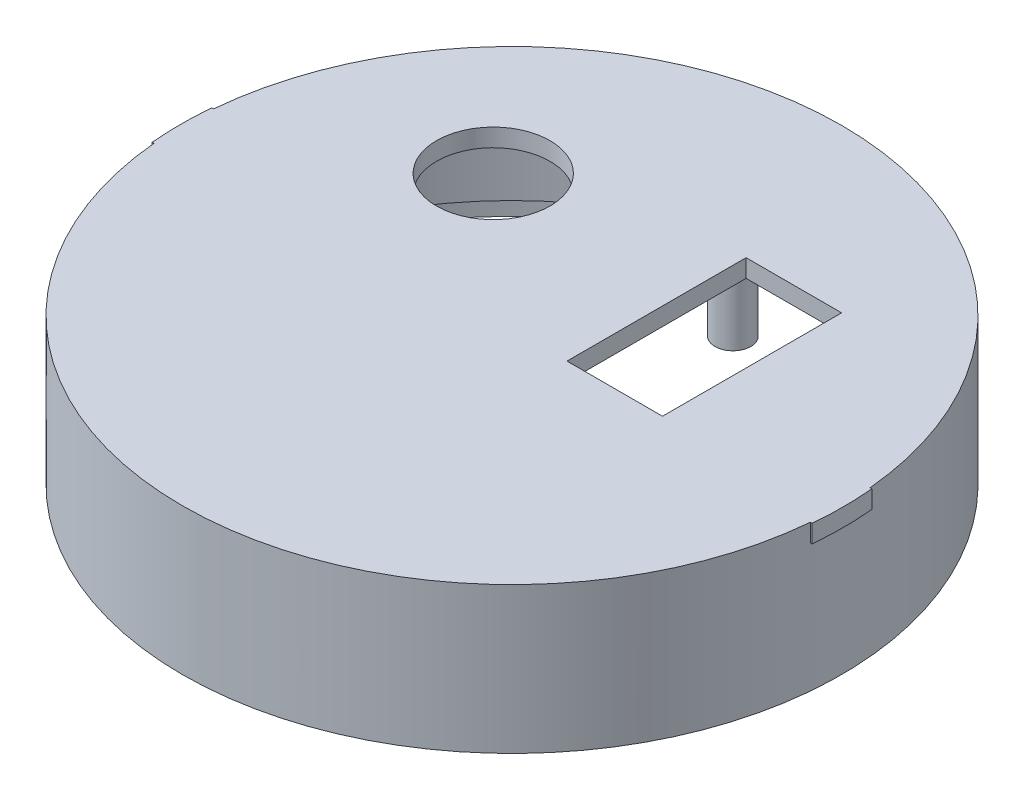
ISO-10303-21;
HEADER;
FILE_DESCRIPTION(('STEP AP214'),'2;1');
FILE_NAME('part.step','',(''),(''),'','','');
FILE_SCHEMA(('AUTOMOTIVE_DESIGN { 1 0 10303 214 1 1 1 1 }'));
ENDSEC;
DATA;
#1=APPLICATION_CONTEXT('core data for automotive mechanical design processes');
#2=APPLICATION_PROTOCOL_DEFINITION('international standard','automotive_design',2000,#1);
#3=PRODUCT_CONTEXT('',#1,'mechanical');
#4=PRODUCT('Part','Part','',(#3));
#5=PRODUCT_RELATED_PRODUCT_CATEGORY('part','',(#4));
#6=PRODUCT_DEFINITION_FORMATION('','',#4);
#7=PRODUCT_DEFINITION_CONTEXT('part definition',#1,'design');
#8=PRODUCT_DEFINITION('design','',#6,#7);
#9=PRODUCT_DEFINITION_SHAPE('','',#8);
#10=(LENGTH_UNIT() NAMED_UNIT(*) SI_UNIT(.MILLI.,.METRE.));
#11=(NAMED_UNIT(*) PLANE_ANGLE_UNIT() SI_UNIT($,.RADIAN.));
#12=(NAMED_UNIT(*) SI_UNIT($,.STERADIAN.) SOLID_ANGLE_UNIT());
#13=UNCERTAINTY_MEASURE_WITH_UNIT(LENGTH_MEASURE(1.E-05),#10,'distance_accuracy_value','');
#14=(GEOMETRIC_REPRESENTATION_CONTEXT(3) GLOBAL_UNCERTAINTY_ASSIGNED_CONTEXT((#13)) GLOBAL_UNIT_ASSIGNED_CONTEXT((#10,
#11,#12)) REPRESENTATION_CONTEXT('',''));
#15=CARTESIAN_POINT('',(0.,0.,0.));
#16=DIRECTION('',(0.,0.,1.));
#17=DIRECTION('',(1.,0.,0.));
#18=AXIS2_PLACEMENT_3D('',#15,#16,#17);
#19=CARTESIAN_POINT('',(0.,0.,0.));
#20=DIRECTION('',(0.,1.,0.));
#21=DIRECTION('',(0.,0.,1.));
#22=AXIS2_PLACEMENT_3D('',#19,#20,#21);
#23=CYLINDRICAL_SURFACE('',#22,55.);
#24=DIRECTION('',(0.,1.,0.));
#25=VECTOR('',#24,1.);
#26=CARTESIAN_POINT('',(-54.7722557505166,0.,5.));
#27=LINE('',#26,#25);
#28=CARTESIAN_POINT('',(-54.7722557505166,0.,5.));
#29=VERTEX_POINT('',#28);
#30=CARTESIAN_POINT('',(-54.7722557505166,3.,5.));
#31=VERTEX_POINT('',#30);
#32=EDGE_CURVE('E315',#29,#31,#27,.T.);
#33=ORIENTED_EDGE('',*,*,#32,.T.);
#34=CARTESIAN_POINT('',(0.,3.,0.));
#35=DIRECTION('',(0.,1.,0.));
#36=DIRECTION('',(0.,0.,1.));
#37=AXIS2_PLACEMENT_3D('',#34,#35,#36);
#38=CIRCLE('',#37,55.);
#39=CARTESIAN_POINT('',(-54.7722557505166,3.,-4.99999999999996));
#40=VERTEX_POINT('',#39);
#41=EDGE_CURVE('E343',#31,#40,#38,.T.);
#42=ORIENTED_EDGE('',*,*,#41,.T.);
#43=DIRECTION('',(0.,1.,0.));
#44=VECTOR('',#43,1.);
#45=CARTESIAN_POINT('',(-54.7722557505166,0.,-4.99999999999996));
#46=LINE('',#45,#44);
#47=CARTESIAN_POINT('',(-54.7722557505166,0.,-4.99999999999996));
#48=VERTEX_POINT('',#47);
#49=EDGE_CURVE('E308',#48,#40,#46,.T.);
#50=ORIENTED_EDGE('',*,*,#49,.F.);
#51=CARTESIAN_POINT('',(0.,0.,0.));
#52=DIRECTION('',(0.,1.,0.));
#53=DIRECTION('',(0.,0.,1.));
#54=AXIS2_PLACEMENT_3D('',#51,#52,#53);
#55=CIRCLE('',#54,55.);
#56=EDGE_CURVE('E53',#29,#48,#55,.T.);
#57=ORIENTED_EDGE('',*,*,#56,.F.);
#58=EDGE_LOOP('',(#33,#42,#50,#57));
#59=FACE_BOUND('',#58,.T.);
#60=ADVANCED_FACE('F45',(#59),#23,.F.);
#61=CARTESIAN_POINT('',(0.,3.,0.));
#62=DIRECTION('',(0.,1.,0.));
#63=DIRECTION('',(0.,0.,1.));
#64=AXIS2_PLACEMENT_3D('',#61,#62,#63);
#65=PLANE('',#64);
#66=DIRECTION('',(-1.,0.,0.));
#67=VECTOR('',#66,1.);
#68=CARTESIAN_POINT('',(-45.2,3.,5.));
#69=LINE('',#68,#67);
#70=CARTESIAN_POINT('',(-53.7680202350803,3.,5.));
#71=VERTEX_POINT('',#70);
#72=EDGE_CURVE('E297',#71,#31,#69,.T.);
#73=ORIENTED_EDGE('',*,*,#72,.F.);
#74=CARTESIAN_POINT('',(0.,3.,0.));
#75=DIRECTION('',(0.,1.,0.));
#76=DIRECTION('',(0.,0.,1.));
#77=AXIS2_PLACEMENT_3D('',#74,#75,#76);
#78=CIRCLE('',#77,54.);
#79=CARTESIAN_POINT('',(-53.7680202350803,3.,-4.99999999999996));
#80=VERTEX_POINT('',#79);
#81=EDGE_CURVE('E317',#71,#80,#78,.T.);
#82=ORIENTED_EDGE('',*,*,#81,.T.);
#83=DIRECTION('',(1.,0.,0.));
#84=VECTOR('',#83,1.);
#85=CARTESIAN_POINT('',(-45.2,3.,-4.99999999999996));
#86=LINE('',#85,#84);
#87=EDGE_CURVE('E302',#40,#80,#86,.T.);
#88=ORIENTED_EDGE('',*,*,#87,.F.);
#89=ORIENTED_EDGE('',*,*,#41,.F.);
#90=EDGE_LOOP('',(#73,#82,#88,#89));
#91=FACE_BOUND('',#90,.T.);
#92=ADVANCED_FACE('F367',(#91),#65,.F.);
#93=CARTESIAN_POINT('',(0.,3.,0.));
#94=DIRECTION('',(0.,-1.,0.));
#95=DIRECTION('',(0.,0.,-1.));
#96=AXIS2_PLACEMENT_3D('',#93,#94,#95);
#97=CYLINDRICAL_SURFACE('',#96,55.2);
#98=CARTESIAN_POINT('',(0.,0.,0.));
#99=DIRECTION('',(0.,1.,0.));
#100=DIRECTION('',(0.,0.,1.));
#101=AXIS2_PLACEMENT_3D('',#98,#99,#100);
#102=CIRCLE('',#101,55.2);
#103=CARTESIAN_POINT('',(0.,0.,55.2));
#104=VERTEX_POINT('',#103);
#105=EDGE_CURVE('E12',#104,#104,#102,.T.);
#106=ORIENTED_EDGE('',*,*,#105,.T.);
#107=EDGE_LOOP('',(#106));
#108=FACE_BOUND('',#107,.T.);
#109=CARTESIAN_POINT('',(0.,21.5,0.));
#110=DIRECTION('',(0.,1.,0.));
#111=DIRECTION('',(0.,0.,1.));
#112=AXIS2_PLACEMENT_3D('',#109,#110,#111);
#113=CIRCLE('',#112,55.2);
#114=CARTESIAN_POINT('',(54.9730843231485,21.5,5.));
#115=VERTEX_POINT('',#114);
#116=CARTESIAN_POINT('',(54.9730843231486,21.5,-4.99999999999996));
#117=VERTEX_POINT('',#116);
#118=EDGE_CURVE('E341',#115,#117,#113,.T.);
#119=ORIENTED_EDGE('',*,*,#118,.F.);
#120=DIRECTION('',(0.,-1.,0.));
#121=VECTOR('',#120,1.);
#122=CARTESIAN_POINT('',(54.9730843231485,24.5,5.));
#123=LINE('',#122,#121);
#124=CARTESIAN_POINT('',(54.9730843231485,24.5,5.));
#125=VERTEX_POINT('',#124);
#126=EDGE_CURVE('E294',#125,#115,#123,.T.);
#127=ORIENTED_EDGE('',*,*,#126,.F.);
#128=CARTESIAN_POINT('',(0.,24.5,0.));
#129=DIRECTION('',(0.,1.,0.));
#130=DIRECTION('',(0.,0.,1.));
#131=AXIS2_PLACEMENT_3D('',#128,#129,#130);
#132=CIRCLE('',#131,55.2);
#133=CARTESIAN_POINT('',(-54.9730843231485,24.5,5.));
#134=VERTEX_POINT('',#133);
#135=EDGE_CURVE('E246',#134,#125,#132,.T.);
#136=ORIENTED_EDGE('',*,*,#135,.F.);
#137=DIRECTION('',(0.,-1.,0.));
#138=VECTOR('',#137,1.);
#139=CARTESIAN_POINT('',(-54.9730843231485,24.5,5.));
#140=LINE('',#139,#138);
#141=CARTESIAN_POINT('',(-54.9730843231485,21.5,5.));
#142=VERTEX_POINT('',#141);
#143=EDGE_CURVE('E264',#134,#142,#140,.T.);
#144=ORIENTED_EDGE('',*,*,#143,.T.);
#145=CARTESIAN_POINT('',(-54.9730843231486,21.5,-4.99999999999996));
#146=VERTEX_POINT('',#145);
#147=EDGE_CURVE('E60',#146,#142,#113,.T.);
#148=ORIENTED_EDGE('',*,*,#147,.F.);
#149=DIRECTION('',(0.,-1.,0.));
#150=VECTOR('',#149,1.);
#151=CARTESIAN_POINT('',(-54.9730843231486,24.5,-4.99999999999996));
#152=LINE('',#151,#150);
#153=CARTESIAN_POINT('',(-54.9730843231486,24.5,-4.99999999999996));
#154=VERTEX_POINT('',#153);
#155=EDGE_CURVE('E283',#154,#146,#152,.T.);
#156=ORIENTED_EDGE('',*,*,#155,.F.);
#157=CARTESIAN_POINT('',(0.,24.5,0.));
#158=DIRECTION('',(0.,1.,0.));
#159=DIRECTION('',(0.,0.,1.));
#160=AXIS2_PLACEMENT_3D('',#157,#158,#159);
#161=CIRCLE('',#160,55.2);
#162=CARTESIAN_POINT('',(54.9730843231486,24.5,-4.99999999999996));
#163=VERTEX_POINT('',#162);
#164=EDGE_CURVE('E256',#163,#154,#161,.T.);
#165=ORIENTED_EDGE('',*,*,#164,.F.);
#166=DIRECTION('',(0.,-1.,0.));
#167=VECTOR('',#166,1.);
#168=CARTESIAN_POINT('',(54.9730843231486,24.5,-4.99999999999996));
#169=LINE('',#168,#167);
#170=EDGE_CURVE('E285',#163,#117,#169,.T.);
#171=ORIENTED_EDGE('',*,*,#170,.T.);
#172=EDGE_LOOP('',(#119,#127,#136,#144,#148,#156,#165,#171));
#173=FACE_BOUND('',#172,.T.);
#174=ADVANCED_FACE('F47',(#108,#173),#97,.T.);
#175=CARTESIAN_POINT('',(0.,0.,0.));
#176=DIRECTION('',(0.,1.,0.));
#177=DIRECTION('',(0.,0.,1.));
#178=AXIS2_PLACEMENT_3D('',#175,#176,#177);
#179=PLANE('',#178);
#180=ORIENTED_EDGE('',*,*,#56,.T.);
#181=DIRECTION('',(1.,0.,0.));
#182=VECTOR('',#181,1.);
#183=CARTESIAN_POINT('',(-45.2,0.,-4.99999999999996));
#184=LINE('',#183,#182);
#185=CARTESIAN_POINT('',(-45.2,0.,-4.99999999999996));
#186=VERTEX_POINT('',#185);
#187=EDGE_CURVE('E305',#48,#186,#184,.T.);
#188=ORIENTED_EDGE('',*,*,#187,.T.);
#189=DIRECTION('',(0.,0.,1.));
#190=VECTOR('',#189,1.);
#191=CARTESIAN_POINT('',(-45.2,0.,5.));
#192=LINE('',#191,#190);
#193=CARTESIAN_POINT('',(-45.2,0.,5.));
#194=VERTEX_POINT('',#193);
#195=EDGE_CURVE('E298',#186,#194,#192,.T.);
#196=ORIENTED_EDGE('',*,*,#195,.T.);
#197=DIRECTION('',(-1.,0.,0.));
#198=VECTOR('',#197,1.);
#199=CARTESIAN_POINT('',(-45.2,0.,5.));
#200=LINE('',#199,#198);
#201=EDGE_CURVE('E301',#194,#29,#200,.T.);
#202=ORIENTED_EDGE('',*,*,#201,.T.);
#203=EDGE_LOOP('',(#180,#188,#196,#202));
#204=FACE_BOUND('',#203,.T.);
#205=ORIENTED_EDGE('',*,*,#105,.F.);
#206=EDGE_LOOP('',(#205));
#207=FACE_BOUND('',#206,.T.);
#208=ADVANCED_FACE('F358',(#204,#207),#179,.F.);
#209=CARTESIAN_POINT('',(-45.2,21.5,-5.));
#210=DIRECTION('',(0.,0.,-1.));
#211=DIRECTION('',(-1.,0.,0.));
#212=AXIS2_PLACEMENT_3D('',#209,#210,#211);
#213=PLANE('',#212);
#214=DIRECTION('',(0.,-1.,0.));
#215=VECTOR('',#214,1.);
#216=CARTESIAN_POINT('',(-45.2,21.5,-5.));
#217=LINE('',#216,#215);
#218=CARTESIAN_POINT('',(-45.2,21.5,-5.));
#219=VERTEX_POINT('',#218);
#220=EDGE_CURVE('E339',#219,#186,#217,.T.);
#221=ORIENTED_EDGE('',*,*,#220,.T.);
#222=ORIENTED_EDGE('',*,*,#187,.F.);
#223=ORIENTED_EDGE('',*,*,#49,.T.);
#224=ORIENTED_EDGE('',*,*,#87,.T.);
#225=DIRECTION('',(0.,-1.,0.));
#226=VECTOR('',#225,1.);
#227=CARTESIAN_POINT('',(-53.7680202350803,21.5,-4.99999999999996));
#228=LINE('',#227,#226);
#229=CARTESIAN_POINT('',(-53.7680202350803,21.5,-4.99999999999996));
#230=VERTEX_POINT('',#229);
#231=EDGE_CURVE('E330',#230,#80,#228,.T.);
#232=ORIENTED_EDGE('',*,*,#231,.F.);
#233=DIRECTION('',(1.,0.,0.));
#234=VECTOR('',#233,1.);
#235=CARTESIAN_POINT('',(-45.2,21.5,-5.));
#236=LINE('',#235,#234);
#237=EDGE_CURVE('E318',#230,#219,#236,.T.);
#238=ORIENTED_EDGE('',*,*,#237,.T.);
#239=EDGE_LOOP('',(#221,#222,#223,#224,#232,#238));
#240=FACE_BOUND('',#239,.T.);
#241=ADVANCED_FACE('F353',(#240),#213,.T.);
#242=CARTESIAN_POINT('',(-45.2,21.5,5.));
#243=DIRECTION('',(1.,0.,0.));
#244=DIRECTION('',(0.,0.,-1.));
#245=AXIS2_PLACEMENT_3D('',#242,#243,#244);
#246=PLANE('',#245);
#247=DIRECTION('',(0.,-1.,0.));
#248=VECTOR('',#247,1.);
#249=CARTESIAN_POINT('',(-45.2,21.5,5.));
#250=LINE('',#249,#248);
#251=CARTESIAN_POINT('',(-45.2,21.5,5.));
#252=VERTEX_POINT('',#251);
#253=EDGE_CURVE('E337',#252,#194,#250,.T.);
#254=ORIENTED_EDGE('',*,*,#253,.T.);
#255=ORIENTED_EDGE('',*,*,#195,.F.);
#256=ORIENTED_EDGE('',*,*,#220,.F.);
#257=DIRECTION('',(0.,0.,1.));
#258=VECTOR('',#257,1.);
#259=CARTESIAN_POINT('',(-45.2,21.5,5.));
#260=LINE('',#259,#258);
#261=EDGE_CURVE('E321',#219,#252,#260,.T.);
#262=ORIENTED_EDGE('',*,*,#261,.T.);
#263=EDGE_LOOP('',(#254,#255,#256,#262));
#264=FACE_BOUND('',#263,.T.);
#265=ADVANCED_FACE('F361',(#264),#246,.T.);
#266=CARTESIAN_POINT('',(-45.2,21.5,5.));
#267=DIRECTION('',(0.,0.,1.));
#268=DIRECTION('',(1.,0.,0.));
#269=AXIS2_PLACEMENT_3D('',#266,#267,#268);
#270=PLANE('',#269);
#271=DIRECTION('',(0.,-1.,0.));
#272=VECTOR('',#271,1.);
#273=CARTESIAN_POINT('',(-53.7680202350803,21.5,5.));
#274=LINE('',#273,#272);
#275=CARTESIAN_POINT('',(-53.7680202350803,21.5,5.));
#276=VERTEX_POINT('',#275);
#277=EDGE_CURVE('E334',#276,#71,#274,.T.);
#278=ORIENTED_EDGE('',*,*,#277,.T.);
#279=ORIENTED_EDGE('',*,*,#72,.T.);
#280=ORIENTED_EDGE('',*,*,#32,.F.);
#281=ORIENTED_EDGE('',*,*,#201,.F.);
#282=ORIENTED_EDGE('',*,*,#253,.F.);
#283=DIRECTION('',(-1.,0.,0.));
#284=VECTOR('',#283,1.);
#285=CARTESIAN_POINT('',(-45.2,21.5,5.));
#286=LINE('',#285,#284);
#287=EDGE_CURVE('E324',#252,#276,#286,.T.);
#288=ORIENTED_EDGE('',*,*,#287,.T.);
#289=EDGE_LOOP('',(#278,#279,#280,#281,#282,#288));
#290=FACE_BOUND('',#289,.T.);
#291=ADVANCED_FACE('F365',(#290),#270,.T.);
#292=CARTESIAN_POINT('',(0.,21.5,0.));
#293=DIRECTION('',(0.,-1.,0.));
#294=DIRECTION('',(0.,0.,-1.));
#295=AXIS2_PLACEMENT_3D('',#292,#293,#294);
#296=CYLINDRICAL_SURFACE('',#295,54.);
#297=ORIENTED_EDGE('',*,*,#81,.F.);
#298=ORIENTED_EDGE('',*,*,#277,.F.);
#299=CARTESIAN_POINT('',(0.,21.5,0.));
#300=DIRECTION('',(0.,1.,0.));
#301=DIRECTION('',(0.,0.,1.));
#302=AXIS2_PLACEMENT_3D('',#299,#300,#301);
#303=CIRCLE('',#302,54.);
#304=EDGE_CURVE('E327',#276,#230,#303,.T.);
#305=ORIENTED_EDGE('',*,*,#304,.T.);
#306=ORIENTED_EDGE('',*,*,#231,.T.);
#307=EDGE_LOOP('',(#297,#298,#305,#306));
#308=FACE_BOUND('',#307,.T.);
#309=ADVANCED_FACE('F369',(#308),#296,.F.);
#310=CARTESIAN_POINT('',(0.,21.5,0.));
#311=DIRECTION('',(0.,1.,0.));
#312=DIRECTION('',(0.,0.,1.));
#313=AXIS2_PLACEMENT_3D('',#310,#311,#312);
#314=PLANE('',#313);
#315=DIRECTION('',(1.,0.,0.));
#316=VECTOR('',#315,1.);
#317=CARTESIAN_POINT('',(55.2743159161649,21.5,5.));
#318=LINE('',#317,#316);
#319=CARTESIAN_POINT('',(55.2743159161649,21.5,5.));
#320=VERTEX_POINT('',#319);
#321=EDGE_CURVE('E243',#115,#320,#318,.T.);
#322=ORIENTED_EDGE('',*,*,#321,.F.);
#323=ORIENTED_EDGE('',*,*,#118,.T.);
#324=DIRECTION('',(-1.,0.,0.));
#325=VECTOR('',#324,1.);
#326=CARTESIAN_POINT('',(55.2743159161649,21.5,-4.99999999999996));
#327=LINE('',#326,#325);
#328=CARTESIAN_POINT('',(55.2743159161649,21.5,-4.99999999999996));
#329=VERTEX_POINT('',#328);
#330=EDGE_CURVE('E268',#329,#117,#327,.T.);
#331=ORIENTED_EDGE('',*,*,#330,.F.);
#332=CARTESIAN_POINT('',(0.,21.5,0.));
#333=DIRECTION('',(0.,1.,0.));
#334=DIRECTION('',(0.,0.,-1.));
#335=AXIS2_PLACEMENT_3D('',#332,#333,#334);
#336=CIRCLE('',#335,55.5);
#337=EDGE_CURVE('E266',#320,#329,#336,.T.);
#338=ORIENTED_EDGE('',*,*,#337,.F.);
#339=EDGE_LOOP('',(#322,#323,#331,#338));
#340=FACE_BOUND('',#339,.T.);
#341=ADVANCED_FACE('F378',(#340),#314,.F.);
#342=DIRECTION('',(-1.,0.,0.));
#343=VECTOR('',#342,1.);
#344=CARTESIAN_POINT('',(-55.2743159161649,21.5,-4.99999999999996));
#345=LINE('',#344,#343);
#346=CARTESIAN_POINT('',(-55.2743159161649,21.5,-4.99999999999997));
#347=VERTEX_POINT('',#346);
#348=EDGE_CURVE('E271',#146,#347,#345,.T.);
#349=ORIENTED_EDGE('',*,*,#348,.F.);
#350=ORIENTED_EDGE('',*,*,#147,.T.);
#351=DIRECTION('',(1.,0.,0.));
#352=VECTOR('',#351,1.);
#353=CARTESIAN_POINT('',(-55.2743159161649,21.5,5.));
#354=LINE('',#353,#352);
#355=CARTESIAN_POINT('',(-55.2743159161649,21.5,5.));
#356=VERTEX_POINT('',#355);
#357=EDGE_CURVE('E250',#356,#142,#354,.T.);
#358=ORIENTED_EDGE('',*,*,#357,.F.);
#359=CARTESIAN_POINT('',(0.,21.5,0.));
#360=DIRECTION('',(0.,1.,0.));
#361=DIRECTION('',(0.,0.,1.));
#362=AXIS2_PLACEMENT_3D('',#359,#360,#361);
#363=CIRCLE('',#362,55.5);
#364=EDGE_CURVE('E273',#347,#356,#363,.T.);
#365=ORIENTED_EDGE('',*,*,#364,.F.);
#366=EDGE_LOOP('',(#349,#350,#358,#365));
#367=FACE_BOUND('',#366,.T.);
#368=ADVANCED_FACE('F379',(#367),#314,.F.);
#369=CARTESIAN_POINT('',(0.,24.5,0.));
#370=DIRECTION('',(0.,1.,0.));
#371=DIRECTION('',(0.,0.,1.));
#372=AXIS2_PLACEMENT_3D('',#369,#370,#371);
#373=PLANE('',#372);
#374=ORIENTED_EDGE('',*,*,#135,.T.);
#375=DIRECTION('',(1.,0.,0.));
#376=VECTOR('',#375,1.);
#377=CARTESIAN_POINT('',(55.2743159161649,24.5,5.));
#378=LINE('',#377,#376);
#379=CARTESIAN_POINT('',(55.2743159161649,24.5,5.));
#380=VERTEX_POINT('',#379);
#381=EDGE_CURVE('E249',#125,#380,#378,.T.);
#382=ORIENTED_EDGE('',*,*,#381,.T.);
#383=CARTESIAN_POINT('',(0.,24.5,0.));
#384=DIRECTION('',(0.,1.,0.));
#385=DIRECTION('',(0.,0.,-1.));
#386=AXIS2_PLACEMENT_3D('',#383,#384,#385);
#387=CIRCLE('',#386,55.5);
#388=CARTESIAN_POINT('',(55.2743159161649,24.5,-4.99999999999996));
#389=VERTEX_POINT('',#388);
#390=EDGE_CURVE('E252',#380,#389,#387,.T.);
#391=ORIENTED_EDGE('',*,*,#390,.T.);
#392=DIRECTION('',(-1.,0.,0.));
#393=VECTOR('',#392,1.);
#394=CARTESIAN_POINT('',(55.2743159161649,24.5,-4.99999999999996));
#395=LINE('',#394,#393);
#396=EDGE_CURVE('E254',#389,#163,#395,.T.);
#397=ORIENTED_EDGE('',*,*,#396,.T.);
#398=ORIENTED_EDGE('',*,*,#164,.T.);
#399=DIRECTION('',(-1.,0.,0.));
#400=VECTOR('',#399,1.);
#401=CARTESIAN_POINT('',(-55.2743159161649,24.5,-4.99999999999996));
#402=LINE('',#401,#400);
#403=CARTESIAN_POINT('',(-55.2743159161649,24.5,-4.99999999999997));
#404=VERTEX_POINT('',#403);
#405=EDGE_CURVE('E258',#154,#404,#402,.T.);
#406=ORIENTED_EDGE('',*,*,#405,.T.);
#407=CARTESIAN_POINT('',(0.,24.5,0.));
#408=DIRECTION('',(0.,1.,0.));
#409=DIRECTION('',(0.,0.,1.));
#410=AXIS2_PLACEMENT_3D('',#407,#408,#409);
#411=CIRCLE('',#410,55.5);
#412=CARTESIAN_POINT('',(-55.2743159161649,24.5,5.));
#413=VERTEX_POINT('',#412);
#414=EDGE_CURVE('E260',#404,#413,#411,.T.);
#415=ORIENTED_EDGE('',*,*,#414,.T.);
#416=DIRECTION('',(1.,0.,0.));
#417=VECTOR('',#416,1.);
#418=CARTESIAN_POINT('',(-55.2743159161649,24.5,5.));
#419=LINE('',#418,#417);
#420=EDGE_CURVE('E262',#413,#134,#419,.T.);
#421=ORIENTED_EDGE('',*,*,#420,.T.);
#422=EDGE_LOOP('',(#374,#382,#391,#397,#398,#406,#415,#421));
#423=FACE_BOUND('',#422,.T.);
#424=CARTESIAN_POINT('',(-22.20107336,24.5,-19.0598735911412));
#425=DIRECTION('',(0.,1.,0.));
#426=DIRECTION('',(0.,0.,1.));
#427=AXIS2_PLACEMENT_3D('',#424,#425,#426);
#428=CIRCLE('',#427,9.5);
#429=CARTESIAN_POINT('',(-22.20107336,24.5,-9.55987359114121));
#430=VERTEX_POINT('',#429);
#431=EDGE_CURVE('E240',#430,#430,#428,.T.);
#432=ORIENTED_EDGE('',*,*,#431,.F.);
#433=EDGE_LOOP('',(#432));
#434=FACE_BOUND('',#433,.T.);
#435=DIRECTION('',(-1.,0.,0.));
#436=VECTOR('',#435,1.);
#437=CARTESIAN_POINT('',(11.2131087855635,24.5,-28.));
#438=LINE('',#437,#436);
#439=CARTESIAN_POINT('',(27.2131087855635,24.5,-28.));
#440=VERTEX_POINT('',#439);
#441=CARTESIAN_POINT('',(11.2131087855635,24.5,-28.));
#442=VERTEX_POINT('',#441);
#443=EDGE_CURVE('E211',#440,#442,#438,.T.);
#444=ORIENTED_EDGE('',*,*,#443,.F.);
#445=DIRECTION('',(0.,0.,-1.));
#446=VECTOR('',#445,1.);
#447=CARTESIAN_POINT('',(27.2131087855635,24.5,-28.));
#448=LINE('',#447,#446);
#449=CARTESIAN_POINT('',(27.2131087855635,24.5,2.));
#450=VERTEX_POINT('',#449);
#451=EDGE_CURVE('E209',#450,#440,#448,.T.);
#452=ORIENTED_EDGE('',*,*,#451,.F.);
#453=DIRECTION('',(1.,0.,0.));
#454=VECTOR('',#453,1.);
#455=CARTESIAN_POINT('',(11.2131087855635,24.5,2.));
#456=LINE('',#455,#454);
#457=CARTESIAN_POINT('',(11.2131087855635,24.5,2.));
#458=VERTEX_POINT('',#457);
#459=EDGE_CURVE('E217',#458,#450,#456,.T.);
#460=ORIENTED_EDGE('',*,*,#459,.F.);
#461=DIRECTION('',(0.,0.,1.));
#462=VECTOR('',#461,1.);
#463=CARTESIAN_POINT('',(11.2131087855635,24.5,-28.));
#464=LINE('',#463,#462);
#465=EDGE_CURVE('E214',#442,#458,#464,.T.);
#466=ORIENTED_EDGE('',*,*,#465,.F.);
#467=EDGE_LOOP('',(#444,#452,#460,#466));
#468=FACE_BOUND('',#467,.T.);
#469=ADVANCED_FACE('F375',(#423,#434,#468),#373,.T.);
#470=CARTESIAN_POINT('',(0.,21.5,-37.));
#471=DIRECTION('',(0.,1.,0.));
#472=DIRECTION('',(0.,0.,1.));
#473=AXIS2_PLACEMENT_3D('',#470,#471,#472);
#474=CIRCLE('',#473,3.);
#475=CARTESIAN_POINT('',(0.,21.5,-34.));
#476=VERTEX_POINT('',#475);
#477=EDGE_CURVE('E199',#476,#476,#474,.F.);
#478=ORIENTED_EDGE('',*,*,#477,.F.);
#479=EDGE_LOOP('',(#478));
#480=FACE_BOUND('',#479,.T.);
#481=CARTESIAN_POINT('',(0.,21.5,42.));
#482=DIRECTION('',(0.,1.,0.));
#483=DIRECTION('',(0.,0.,1.));
#484=AXIS2_PLACEMENT_3D('',#481,#482,#483);
#485=CIRCLE('',#484,3.);
#486=CARTESIAN_POINT('',(0.,21.5,45.));
#487=VERTEX_POINT('',#486);
#488=EDGE_CURVE('E202',#487,#487,#485,.F.);
#489=ORIENTED_EDGE('',*,*,#488,.F.);
#490=EDGE_LOOP('',(#489));
#491=FACE_BOUND('',#490,.T.);
#492=ORIENTED_EDGE('',*,*,#261,.F.);
#493=ORIENTED_EDGE('',*,*,#237,.F.);
#494=ORIENTED_EDGE('',*,*,#304,.F.);
#495=ORIENTED_EDGE('',*,*,#287,.F.);
#496=EDGE_LOOP('',(#492,#493,#494,#495));
#497=FACE_BOUND('',#496,.T.);
#498=CARTESIAN_POINT('',(-22.20107336,21.5,-19.0598735911412));
#499=DIRECTION('',(0.,1.,0.));
#500=DIRECTION('',(0.,0.,1.));
#501=AXIS2_PLACEMENT_3D('',#498,#499,#500);
#502=CIRCLE('',#501,9.5);
#503=CARTESIAN_POINT('',(-22.20107336,21.5,-9.55987359114121));
#504=VERTEX_POINT('',#503);
#505=EDGE_CURVE('E239',#504,#504,#502,.T.);
#506=ORIENTED_EDGE('',*,*,#505,.T.);
#507=EDGE_LOOP('',(#506));
#508=FACE_BOUND('',#507,.T.);
#509=DIRECTION('',(0.,0.,-1.));
#510=VECTOR('',#509,1.);
#511=CARTESIAN_POINT('',(27.2131087855635,21.5,-28.));
#512=LINE('',#511,#510);
#513=CARTESIAN_POINT('',(27.2131087855635,21.5,2.));
#514=VERTEX_POINT('',#513);
#515=CARTESIAN_POINT('',(27.2131087855635,21.5,-28.));
#516=VERTEX_POINT('',#515);
#517=EDGE_CURVE('E208',#514,#516,#512,.T.);
#518=ORIENTED_EDGE('',*,*,#517,.T.);
#519=DIRECTION('',(-1.,0.,0.));
#520=VECTOR('',#519,1.);
#521=CARTESIAN_POINT('',(11.2131087855635,21.5,-28.));
#522=LINE('',#521,#520);
#523=CARTESIAN_POINT('',(11.2131087855635,21.5,-28.));
#524=VERTEX_POINT('',#523);
#525=EDGE_CURVE('E222',#516,#524,#522,.T.);
#526=ORIENTED_EDGE('',*,*,#525,.T.);
#527=DIRECTION('',(0.,0.,1.));
#528=VECTOR('',#527,1.);
#529=CARTESIAN_POINT('',(11.2131087855635,21.5,-28.));
#530=LINE('',#529,#528);
#531=CARTESIAN_POINT('',(11.2131087855635,21.5,2.));
#532=VERTEX_POINT('',#531);
#533=EDGE_CURVE('E225',#524,#532,#530,.T.);
#534=ORIENTED_EDGE('',*,*,#533,.T.);
#535=DIRECTION('',(1.,0.,0.));
#536=VECTOR('',#535,1.);
#537=CARTESIAN_POINT('',(11.2131087855635,21.5,2.));
#538=LINE('',#537,#536);
#539=EDGE_CURVE('E212',#532,#514,#538,.T.);
#540=ORIENTED_EDGE('',*,*,#539,.T.);
#541=EDGE_LOOP('',(#518,#526,#534,#540));
#542=FACE_BOUND('',#541,.T.);
#543=ADVANCED_FACE('F371',(#480,#491,#497,#508,#542),#314,.F.);
#544=CARTESIAN_POINT('',(55.2743159161649,24.5,5.));
#545=DIRECTION('',(0.,0.,-1.));
#546=DIRECTION('',(-1.,0.,0.));
#547=AXIS2_PLACEMENT_3D('',#544,#545,#546);
#548=PLANE('',#547);
#549=ORIENTED_EDGE('',*,*,#321,.T.);
#550=DIRECTION('',(0.,-1.,0.));
#551=VECTOR('',#550,1.);
#552=CARTESIAN_POINT('',(55.2743159161649,24.5,5.));
#553=LINE('',#552,#551);
#554=EDGE_CURVE('E291',#380,#320,#553,.T.);
#555=ORIENTED_EDGE('',*,*,#554,.F.);
#556=ORIENTED_EDGE('',*,*,#381,.F.);
#557=ORIENTED_EDGE('',*,*,#126,.T.);
#558=EDGE_LOOP('',(#549,#555,#556,#557));
#559=FACE_BOUND('',#558,.T.);
#560=ADVANCED_FACE('F374',(#559),#548,.F.);
#561=CARTESIAN_POINT('',(0.,24.5,0.));
#562=DIRECTION('',(0.,-1.,0.));
#563=DIRECTION('',(0.,0.,-1.));
#564=AXIS2_PLACEMENT_3D('',#561,#562,#563);
#565=CYLINDRICAL_SURFACE('',#564,55.5);
#566=ORIENTED_EDGE('',*,*,#337,.T.);
#567=DIRECTION('',(0.,-1.,0.));
#568=VECTOR('',#567,1.);
#569=CARTESIAN_POINT('',(55.2743159161649,24.5,-4.99999999999996));
#570=LINE('',#569,#568);
#571=EDGE_CURVE('E288',#389,#329,#570,.T.);
#572=ORIENTED_EDGE('',*,*,#571,.F.);
#573=ORIENTED_EDGE('',*,*,#390,.F.);
#574=ORIENTED_EDGE('',*,*,#554,.T.);
#575=EDGE_LOOP('',(#566,#572,#573,#574));
#576=FACE_BOUND('',#575,.T.);
#577=ADVANCED_FACE('F457',(#576),#565,.T.);
#578=CARTESIAN_POINT('',(55.2743159161649,24.5,-4.99999999999996));
#579=DIRECTION('',(0.,0.,1.));
#580=DIRECTION('',(1.,0.,0.));
#581=AXIS2_PLACEMENT_3D('',#578,#579,#580);
#582=PLANE('',#581);
#583=ORIENTED_EDGE('',*,*,#330,.T.);
#584=ORIENTED_EDGE('',*,*,#170,.F.);
#585=ORIENTED_EDGE('',*,*,#396,.F.);
#586=ORIENTED_EDGE('',*,*,#571,.T.);
#587=EDGE_LOOP('',(#583,#584,#585,#586));
#588=FACE_BOUND('',#587,.T.);
#589=ADVANCED_FACE('F455',(#588),#582,.F.);
#590=CARTESIAN_POINT('',(-55.2743159161649,24.5,-4.99999999999996));
#591=DIRECTION('',(0.,0.,1.));
#592=DIRECTION('',(1.,0.,0.));
#593=AXIS2_PLACEMENT_3D('',#590,#591,#592);
#594=PLANE('',#593);
#595=ORIENTED_EDGE('',*,*,#348,.T.);
#596=DIRECTION('',(0.,-1.,0.));
#597=VECTOR('',#596,1.);
#598=CARTESIAN_POINT('',(-55.2743159161649,24.5,-4.99999999999997));
#599=LINE('',#598,#597);
#600=EDGE_CURVE('E280',#404,#347,#599,.T.);
#601=ORIENTED_EDGE('',*,*,#600,.F.);
#602=ORIENTED_EDGE('',*,*,#405,.F.);
#603=ORIENTED_EDGE('',*,*,#155,.T.);
#604=EDGE_LOOP('',(#595,#601,#602,#603));
#605=FACE_BOUND('',#604,.T.);
#606=ADVANCED_FACE('F451',(#605),#594,.F.);
#607=CARTESIAN_POINT('',(0.,24.5,0.));
#608=DIRECTION('',(0.,-1.,0.));
#609=DIRECTION('',(0.,0.,-1.));
#610=AXIS2_PLACEMENT_3D('',#607,#608,#609);
#611=CYLINDRICAL_SURFACE('',#610,55.5);
#612=ORIENTED_EDGE('',*,*,#364,.T.);
#613=DIRECTION('',(0.,-1.,0.));
#614=VECTOR('',#613,1.);
#615=CARTESIAN_POINT('',(-55.2743159161649,24.5,5.));
#616=LINE('',#615,#614);
#617=EDGE_CURVE('E277',#413,#356,#616,.T.);
#618=ORIENTED_EDGE('',*,*,#617,.F.);
#619=ORIENTED_EDGE('',*,*,#414,.F.);
#620=ORIENTED_EDGE('',*,*,#600,.T.);
#621=EDGE_LOOP('',(#612,#618,#619,#620));
#622=FACE_BOUND('',#621,.T.);
#623=ADVANCED_FACE('F446',(#622),#611,.T.);
#624=CARTESIAN_POINT('',(-55.2743159161649,24.5,5.));
#625=DIRECTION('',(0.,0.,-1.));
#626=DIRECTION('',(-1.,0.,0.));
#627=AXIS2_PLACEMENT_3D('',#624,#625,#626);
#628=PLANE('',#627);
#629=ORIENTED_EDGE('',*,*,#357,.T.);
#630=ORIENTED_EDGE('',*,*,#143,.F.);
#631=ORIENTED_EDGE('',*,*,#420,.F.);
#632=ORIENTED_EDGE('',*,*,#617,.T.);
#633=EDGE_LOOP('',(#629,#630,#631,#632));
#634=FACE_BOUND('',#633,.T.);
#635=ADVANCED_FACE('F442',(#634),#628,.F.);
#636=CARTESIAN_POINT('',(-22.20107336,24.5,-19.0598735911412));
#637=DIRECTION('',(0.,-1.,0.));
#638=DIRECTION('',(0.,0.,-1.));
#639=AXIS2_PLACEMENT_3D('',#636,#637,#638);
#640=CYLINDRICAL_SURFACE('',#639,9.5);
#641=ORIENTED_EDGE('',*,*,#431,.T.);
#642=EDGE_LOOP('',(#641));
#643=FACE_BOUND('',#642,.T.);
#644=ORIENTED_EDGE('',*,*,#505,.F.);
#645=EDGE_LOOP('',(#644));
#646=FACE_BOUND('',#645,.T.);
#647=ADVANCED_FACE('F550',(#643,#646),#640,.F.);
#648=CARTESIAN_POINT('',(27.2131087855635,24.5,-28.));
#649=DIRECTION('',(-1.,0.,0.));
#650=DIRECTION('',(0.,0.,1.));
#651=AXIS2_PLACEMENT_3D('',#648,#649,#650);
#652=PLANE('',#651);
#653=ORIENTED_EDGE('',*,*,#517,.F.);
#654=DIRECTION('',(0.,-1.,0.));
#655=VECTOR('',#654,1.);
#656=CARTESIAN_POINT('',(27.2131087855635,24.5,2.));
#657=LINE('',#656,#655);
#658=EDGE_CURVE('E219',#450,#514,#657,.T.);
#659=ORIENTED_EDGE('',*,*,#658,.F.);
#660=ORIENTED_EDGE('',*,*,#451,.T.);
#661=DIRECTION('',(0.,-1.,0.));
#662=VECTOR('',#661,1.);
#663=CARTESIAN_POINT('',(27.2131087855635,24.5,-28.));
#664=LINE('',#663,#662);
#665=EDGE_CURVE('E236',#440,#516,#664,.T.);
#666=ORIENTED_EDGE('',*,*,#665,.T.);
#667=EDGE_LOOP('',(#653,#659,#660,#666));
#668=FACE_BOUND('',#667,.T.);
#669=ADVANCED_FACE('F385',(#668),#652,.T.);
#670=CARTESIAN_POINT('',(11.2131087855635,24.5,-28.));
#671=DIRECTION('',(0.,0.,1.));
#672=DIRECTION('',(1.,0.,0.));
#673=AXIS2_PLACEMENT_3D('',#670,#671,#672);
#674=PLANE('',#673);
#675=ORIENTED_EDGE('',*,*,#525,.F.);
#676=ORIENTED_EDGE('',*,*,#665,.F.);
#677=ORIENTED_EDGE('',*,*,#443,.T.);
#678=DIRECTION('',(0.,-1.,0.));
#679=VECTOR('',#678,1.);
#680=CARTESIAN_POINT('',(11.2131087855635,24.5,-28.));
#681=LINE('',#680,#679);
#682=EDGE_CURVE('E234',#442,#524,#681,.T.);
#683=ORIENTED_EDGE('',*,*,#682,.T.);
#684=EDGE_LOOP('',(#675,#676,#677,#683));
#685=FACE_BOUND('',#684,.T.);
#686=ADVANCED_FACE('F395',(#685),#674,.T.);
#687=CARTESIAN_POINT('',(11.2131087855635,24.5,-28.));
#688=DIRECTION('',(1.,0.,0.));
#689=DIRECTION('',(0.,0.,-1.));
#690=AXIS2_PLACEMENT_3D('',#687,#688,#689);
#691=PLANE('',#690);
#692=ORIENTED_EDGE('',*,*,#533,.F.);
#693=ORIENTED_EDGE('',*,*,#682,.F.);
#694=ORIENTED_EDGE('',*,*,#465,.T.);
#695=DIRECTION('',(0.,-1.,0.));
#696=VECTOR('',#695,1.);
#697=CARTESIAN_POINT('',(11.2131087855635,24.5,2.));
#698=LINE('',#697,#696);
#699=EDGE_CURVE('E232',#458,#532,#698,.T.);
#700=ORIENTED_EDGE('',*,*,#699,.T.);
#701=EDGE_LOOP('',(#692,#693,#694,#700));
#702=FACE_BOUND('',#701,.T.);
#703=ADVANCED_FACE('F399',(#702),#691,.T.);
#704=CARTESIAN_POINT('',(11.2131087855635,24.5,2.));
#705=DIRECTION('',(0.,0.,-1.));
#706=DIRECTION('',(-1.,0.,0.));
#707=AXIS2_PLACEMENT_3D('',#704,#705,#706);
#708=PLANE('',#707);
#709=ORIENTED_EDGE('',*,*,#539,.F.);
#710=ORIENTED_EDGE('',*,*,#699,.F.);
#711=ORIENTED_EDGE('',*,*,#459,.T.);
#712=ORIENTED_EDGE('',*,*,#658,.T.);
#713=EDGE_LOOP('',(#709,#710,#711,#712));
#714=FACE_BOUND('',#713,.T.);
#715=ADVANCED_FACE('F389',(#714),#708,.T.);
#716=CARTESIAN_POINT('',(0.,24.502,42.));
#717=DIRECTION('',(0.,-1.,0.));
#718=DIRECTION('',(0.,0.,-1.));
#719=AXIS2_PLACEMENT_3D('',#716,#717,#718);
#720=CYLINDRICAL_SURFACE('',#719,3.);
#721=CARTESIAN_POINT('',(0.,3.,42.));
#722=DIRECTION('',(0.,-1.,0.));
#723=DIRECTION('',(0.,0.,-1.));
#724=AXIS2_PLACEMENT_3D('',#721,#722,#723);
#725=CIRCLE('',#724,3.);
#726=CARTESIAN_POINT('',(0.,3.,39.));
#727=VERTEX_POINT('',#726);
#728=EDGE_CURVE('E205',#727,#727,#725,.T.);
#729=ORIENTED_EDGE('',*,*,#728,.F.);
#730=EDGE_LOOP('',(#729));
#731=FACE_BOUND('',#730,.T.);
#732=ORIENTED_EDGE('',*,*,#488,.T.);
#733=EDGE_LOOP('',(#732));
#734=FACE_BOUND('',#733,.T.);
#735=ADVANCED_FACE('F406',(#731,#734),#720,.T.);
#736=CARTESIAN_POINT('',(0.,3.,42.));
#737=DIRECTION('',(0.,-1.,0.));
#738=DIRECTION('',(0.,0.,-1.));
#739=AXIS2_PLACEMENT_3D('',#736,#737,#738);
#740=PLANE('',#739);
#741=CARTESIAN_POINT('',(0.,3.,42.));
#742=DIRECTION('',(0.,-1.,0.));
#743=DIRECTION('',(0.,0.,-1.));
#744=AXIS2_PLACEMENT_3D('',#741,#742,#743);
#745=CIRCLE('',#744,1.5);
#746=CARTESIAN_POINT('',(0.,3.,40.5));
#747=VERTEX_POINT('',#746);
#748=EDGE_CURVE('E186',#747,#747,#745,.T.);
#749=ORIENTED_EDGE('',*,*,#748,.F.);
#750=EDGE_LOOP('',(#749));
#751=FACE_BOUND('',#750,.T.);
#752=ORIENTED_EDGE('',*,*,#728,.T.);
#753=EDGE_LOOP('',(#752));
#754=FACE_BOUND('',#753,.T.);
#755=ADVANCED_FACE('F408',(#751,#754),#740,.T.);
#756=CARTESIAN_POINT('',(0.,24.502,-37.));
#757=DIRECTION('',(0.,-1.,0.));
#758=DIRECTION('',(0.,0.,-1.));
#759=AXIS2_PLACEMENT_3D('',#756,#757,#758);
#760=CYLINDRICAL_SURFACE('',#759,3.);
#761=CARTESIAN_POINT('',(0.,3.,-37.));
#762=DIRECTION('',(0.,-1.,0.));
#763=DIRECTION('',(0.,0.,1.));
#764=AXIS2_PLACEMENT_3D('',#761,#762,#763);
#765=CIRCLE('',#764,3.);
#766=CARTESIAN_POINT('',(0.,3.,-34.));
#767=VERTEX_POINT('',#766);
#768=EDGE_CURVE('E196',#767,#767,#765,.T.);
#769=ORIENTED_EDGE('',*,*,#768,.F.);
#770=EDGE_LOOP('',(#769));
#771=FACE_BOUND('',#770,.T.);
#772=ORIENTED_EDGE('',*,*,#477,.T.);
#773=EDGE_LOOP('',(#772));
#774=FACE_BOUND('',#773,.T.);
#775=ADVANCED_FACE('F604',(#771,#774),#760,.T.);
#776=CARTESIAN_POINT('',(0.,3.,-37.));
#777=DIRECTION('',(0.,1.,0.));
#778=DIRECTION('',(0.,0.,1.));
#779=AXIS2_PLACEMENT_3D('',#776,#777,#778);
#780=PLANE('',#779);
#781=CARTESIAN_POINT('',(0.,3.,-37.));
#782=DIRECTION('',(0.,-1.,0.));
#783=DIRECTION('',(0.,0.,-1.));
#784=AXIS2_PLACEMENT_3D('',#781,#782,#783);
#785=CIRCLE('',#784,1.5);
#786=CARTESIAN_POINT('',(0.,3.,-38.5));
#787=VERTEX_POINT('',#786);
#788=EDGE_CURVE('E185',#787,#787,#785,.T.);
#789=ORIENTED_EDGE('',*,*,#788,.F.);
#790=EDGE_LOOP('',(#789));
#791=FACE_BOUND('',#790,.T.);
#792=ORIENTED_EDGE('',*,*,#768,.T.);
#793=EDGE_LOOP('',(#792));
#794=FACE_BOUND('',#793,.T.);
#795=ADVANCED_FACE('F598',(#791,#794),#780,.F.);
#796=CARTESIAN_POINT('',(0.,17.,-37.));
#797=DIRECTION('',(0.,-1.,0.));
#798=DIRECTION('',(0.,0.,-1.));
#799=AXIS2_PLACEMENT_3D('',#796,#797,#798);
#800=CONICAL_SURFACE('',#799,1.5,1.02974425867665);
#801=CARTESIAN_POINT('',(0.,17.9012909285413,-37.));
#802=VERTEX_POINT('',#801);
#803=VERTEX_LOOP('',#802);
#804=FACE_BOUND('',#803,.T.);
#805=CARTESIAN_POINT('',(0.,17.,-37.));
#806=DIRECTION('',(0.,-1.,0.));
#807=DIRECTION('',(0.,0.,-1.));
#808=AXIS2_PLACEMENT_3D('',#805,#806,#807);
#809=CIRCLE('',#808,1.5);
#810=CARTESIAN_POINT('',(0.,17.,-38.5));
#811=VERTEX_POINT('',#810);
#812=EDGE_CURVE('E189',#811,#811,#809,.T.);
#813=ORIENTED_EDGE('',*,*,#812,.T.);
#814=EDGE_LOOP('',(#813));
#815=FACE_BOUND('',#814,.T.);
#816=ADVANCED_FACE('F614',(#804,#815),#800,.F.);
#817=CARTESIAN_POINT('',(0.,3.,-37.));
#818=DIRECTION('',(0.,-1.,0.));
#819=DIRECTION('',(0.,0.,-1.));
#820=AXIS2_PLACEMENT_3D('',#817,#818,#819);
#821=CYLINDRICAL_SURFACE('',#820,1.5);
#822=ORIENTED_EDGE('',*,*,#812,.F.);
#823=EDGE_LOOP('',(#822));
#824=FACE_BOUND('',#823,.T.);
#825=ORIENTED_EDGE('',*,*,#788,.T.);
#826=EDGE_LOOP('',(#825));
#827=FACE_BOUND('',#826,.T.);
#828=ADVANCED_FACE('F179',(#824,#827),#821,.F.);
#829=CARTESIAN_POINT('',(0.,17.,42.));
#830=DIRECTION('',(0.,-1.,0.));
#831=DIRECTION('',(0.,0.,-1.));
#832=AXIS2_PLACEMENT_3D('',#829,#830,#831);
#833=CONICAL_SURFACE('',#832,1.5,1.02974425867665);
#834=CARTESIAN_POINT('',(0.,17.9012909285413,42.));
#835=VERTEX_POINT('',#834);
#836=VERTEX_LOOP('',#835);
#837=FACE_BOUND('',#836,.T.);
#838=CARTESIAN_POINT('',(0.,17.,42.));
#839=DIRECTION('',(0.,-1.,0.));
#840=DIRECTION('',(0.,0.,-1.));
#841=AXIS2_PLACEMENT_3D('',#838,#839,#840);
#842=CIRCLE('',#841,1.5);
#843=CARTESIAN_POINT('',(0.,17.,40.5));
#844=VERTEX_POINT('',#843);
#845=EDGE_CURVE('E183',#844,#844,#842,.T.);
#846=ORIENTED_EDGE('',*,*,#845,.T.);
#847=EDGE_LOOP('',(#846));
#848=FACE_BOUND('',#847,.T.);
#849=ADVANCED_FACE('F175',(#837,#848),#833,.F.);
#850=CARTESIAN_POINT('',(0.,3.,42.));
#851=DIRECTION('',(0.,-1.,0.));
#852=DIRECTION('',(0.,0.,-1.));
#853=AXIS2_PLACEMENT_3D('',#850,#851,#852);
#854=CYLINDRICAL_SURFACE('',#853,1.5);
#855=ORIENTED_EDGE('',*,*,#845,.F.);
#856=EDGE_LOOP('',(#855));
#857=FACE_BOUND('',#856,.T.);
#858=ORIENTED_EDGE('',*,*,#748,.T.);
#859=EDGE_LOOP('',(#858));
#860=FACE_BOUND('',#859,.T.);
#861=ADVANCED_FACE('F178',(#857,#860),#854,.F.);
#862=CLOSED_SHELL('',(#60,#92,#174,#208,#241,#265,#291,#309,#341,#368,#469,#543,#560,#577,#589,
#606,#623,#635,#647,#669,#686,#703,#715,#735,#755,#775,#795,#816,#828,#849,#861));
#863=MANIFOLD_SOLID_BREP('B2',#862);
#864=ADVANCED_BREP_SHAPE_REPRESENTATION('',(#18,#863),#14);
#865=SHAPE_DEFINITION_REPRESENTATION(#9,#864);
ENDSEC;
END-ISO-10303-21;
